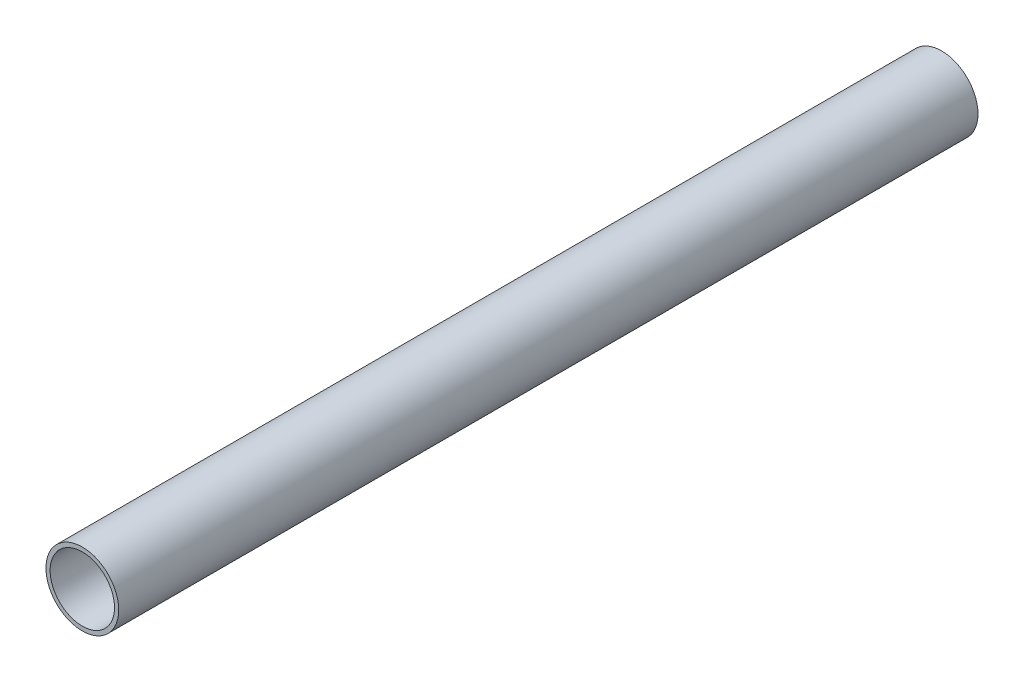
ISO-10303-21;
HEADER;
FILE_DESCRIPTION(('STEP AP214'),'2;1');
FILE_NAME('part.step','',(''),(''),'','','');
FILE_SCHEMA(('AUTOMOTIVE_DESIGN { 1 0 10303 214 1 1 1 1 }'));
ENDSEC;
DATA;
#1=APPLICATION_CONTEXT('core data for automotive mechanical design processes');
#2=APPLICATION_PROTOCOL_DEFINITION('international standard','automotive_design',2000,#1);
#3=PRODUCT_CONTEXT('',#1,'mechanical');
#4=PRODUCT('Part','Part','',(#3));
#5=PRODUCT_RELATED_PRODUCT_CATEGORY('part','',(#4));
#6=PRODUCT_DEFINITION_FORMATION('','',#4);
#7=PRODUCT_DEFINITION_CONTEXT('part definition',#1,'design');
#8=PRODUCT_DEFINITION('design','',#6,#7);
#9=PRODUCT_DEFINITION_SHAPE('','',#8);
#10=(LENGTH_UNIT() NAMED_UNIT(*) SI_UNIT(.MILLI.,.METRE.));
#11=(NAMED_UNIT(*) PLANE_ANGLE_UNIT() SI_UNIT($,.RADIAN.));
#12=(NAMED_UNIT(*) SI_UNIT($,.STERADIAN.) SOLID_ANGLE_UNIT());
#13=UNCERTAINTY_MEASURE_WITH_UNIT(LENGTH_MEASURE(1.E-05),#10,'distance_accuracy_value','');
#14=(GEOMETRIC_REPRESENTATION_CONTEXT(3) GLOBAL_UNCERTAINTY_ASSIGNED_CONTEXT((#13)) GLOBAL_UNIT_ASSIGNED_CONTEXT((#10,
#11,#12)) REPRESENTATION_CONTEXT('',''));
#15=CARTESIAN_POINT('',(0.,0.,0.));
#16=DIRECTION('',(0.,0.,1.));
#17=DIRECTION('',(1.,0.,0.));
#18=AXIS2_PLACEMENT_3D('',#15,#16,#17);
#19=CARTESIAN_POINT('',(0.,0.,-596.9));
#20=DIRECTION('',(0.,0.,1.));
#21=DIRECTION('',(1.,0.,0.));
#22=AXIS2_PLACEMENT_3D('',#19,#20,#21);
#23=CYLINDRICAL_SURFACE('',#22,25.273);
#24=CARTESIAN_POINT('',(0.,0.,-596.9));
#25=DIRECTION('',(0.,0.,1.));
#26=DIRECTION('',(1.,0.,0.));
#27=AXIS2_PLACEMENT_3D('',#24,#25,#26);
#28=CIRCLE('',#27,25.273);
#29=CARTESIAN_POINT('',(25.273,0.,-596.9));
#30=VERTEX_POINT('',#29);
#31=EDGE_CURVE('E10',#30,#30,#28,.T.);
#32=ORIENTED_EDGE('',*,*,#31,.T.);
#33=EDGE_LOOP('',(#32));
#34=FACE_BOUND('',#33,.T.);
#35=CARTESIAN_POINT('',(0.,0.,0.));
#36=DIRECTION('',(0.,0.,1.));
#37=DIRECTION('',(1.,0.,0.));
#38=AXIS2_PLACEMENT_3D('',#35,#36,#37);
#39=CIRCLE('',#38,25.273);
#40=CARTESIAN_POINT('',(25.273,0.,0.));
#41=VERTEX_POINT('',#40);
#42=EDGE_CURVE('E40',#41,#41,#39,.T.);
#43=ORIENTED_EDGE('',*,*,#42,.F.);
#44=EDGE_LOOP('',(#43));
#45=FACE_BOUND('',#44,.T.);
#46=ADVANCED_FACE('F34',(#34,#45),#23,.T.);
#47=CARTESIAN_POINT('',(0.,0.,-596.9));
#48=DIRECTION('',(0.,0.,1.));
#49=DIRECTION('',(1.,0.,0.));
#50=AXIS2_PLACEMENT_3D('',#47,#48,#49);
#51=PLANE('',#50);
#52=CARTESIAN_POINT('',(0.,0.,-596.9));
#53=DIRECTION('',(0.,0.,1.));
#54=DIRECTION('',(1.,0.,0.));
#55=AXIS2_PLACEMENT_3D('',#52,#53,#54);
#56=CIRCLE('',#55,22.352);
#57=CARTESIAN_POINT('',(22.352,0.,-596.9));
#58=VERTEX_POINT('',#57);
#59=EDGE_CURVE('E44',#58,#58,#56,.T.);
#60=ORIENTED_EDGE('',*,*,#59,.T.);
#61=EDGE_LOOP('',(#60));
#62=FACE_BOUND('',#61,.T.);
#63=ORIENTED_EDGE('',*,*,#31,.F.);
#64=EDGE_LOOP('',(#63));
#65=FACE_BOUND('',#64,.T.);
#66=ADVANCED_FACE('F58',(#62,#65),#51,.F.);
#67=CARTESIAN_POINT('',(0.,0.,0.));
#68=DIRECTION('',(0.,0.,1.));
#69=DIRECTION('',(1.,0.,0.));
#70=AXIS2_PLACEMENT_3D('',#67,#68,#69);
#71=PLANE('',#70);
#72=CARTESIAN_POINT('',(0.,0.,0.));
#73=DIRECTION('',(0.,0.,1.));
#74=DIRECTION('',(1.,0.,0.));
#75=AXIS2_PLACEMENT_3D('',#72,#73,#74);
#76=CIRCLE('',#75,22.352);
#77=CARTESIAN_POINT('',(22.352,0.,0.));
#78=VERTEX_POINT('',#77);
#79=EDGE_CURVE('E48',#78,#78,#76,.T.);
#80=ORIENTED_EDGE('',*,*,#79,.F.);
#81=EDGE_LOOP('',(#80));
#82=FACE_BOUND('',#81,.T.);
#83=ORIENTED_EDGE('',*,*,#42,.T.);
#84=EDGE_LOOP('',(#83));
#85=FACE_BOUND('',#84,.T.);
#86=ADVANCED_FACE('F56',(#82,#85),#71,.T.);
#87=CARTESIAN_POINT('',(0.,0.,-596.9));
#88=DIRECTION('',(0.,0.,1.));
#89=DIRECTION('',(1.,0.,0.));
#90=AXIS2_PLACEMENT_3D('',#87,#88,#89);
#91=CYLINDRICAL_SURFACE('',#90,22.352);
#92=ORIENTED_EDGE('',*,*,#59,.F.);
#93=EDGE_LOOP('',(#92));
#94=FACE_BOUND('',#93,.T.);
#95=ORIENTED_EDGE('',*,*,#79,.T.);
#96=EDGE_LOOP('',(#95));
#97=FACE_BOUND('',#96,.T.);
#98=ADVANCED_FACE('F54',(#94,#97),#91,.F.);
#99=CLOSED_SHELL('',(#46,#66,#86,#98));
#100=MANIFOLD_SOLID_BREP('B2',#99);
#101=ADVANCED_BREP_SHAPE_REPRESENTATION('',(#18,#100),#14);
#102=SHAPE_DEFINITION_REPRESENTATION(#9,#101);
ENDSEC;
END-ISO-10303-21;
